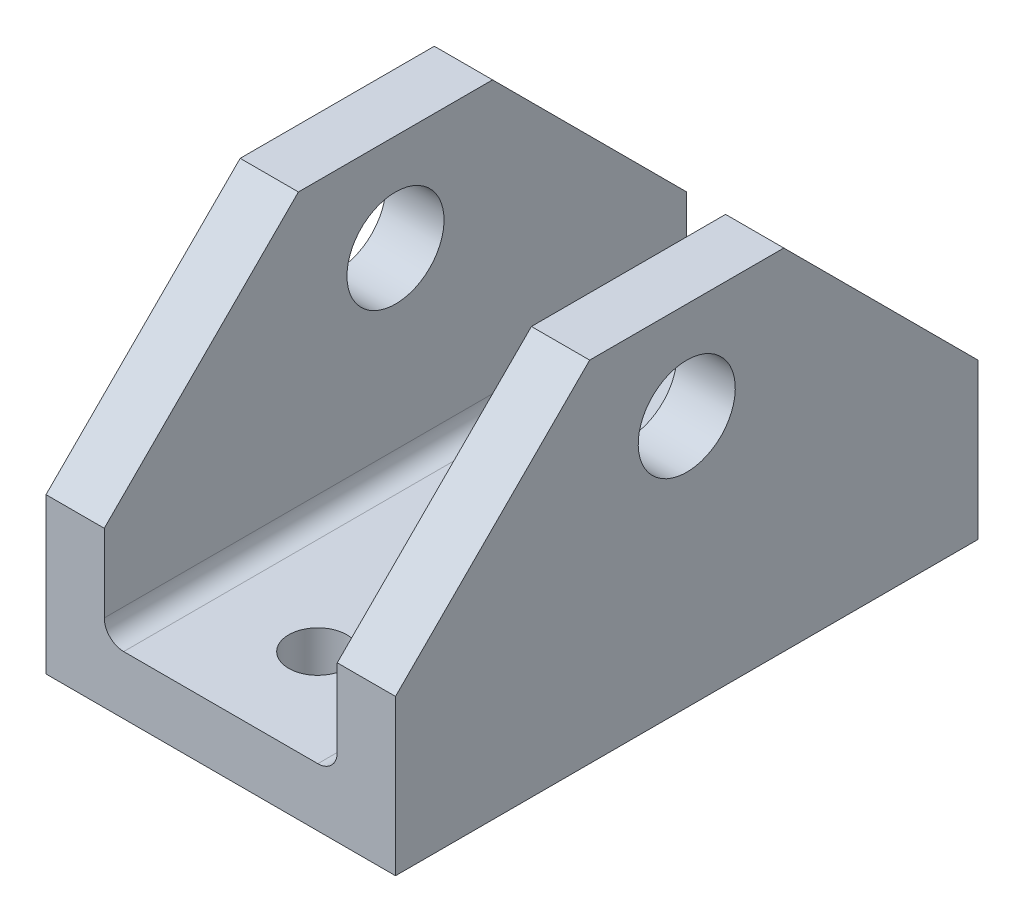
ISO-10303-21;
HEADER;
FILE_DESCRIPTION(('STEP AP214'),'2;1');
FILE_NAME('part.step','',(''),(''),'','','');
FILE_SCHEMA(('AUTOMOTIVE_DESIGN { 1 0 10303 214 1 1 1 1 }'));
ENDSEC;
DATA;
#1=APPLICATION_CONTEXT('core data for automotive mechanical design processes');
#2=APPLICATION_PROTOCOL_DEFINITION('international standard','automotive_design',2000,#1);
#3=PRODUCT_CONTEXT('',#1,'mechanical');
#4=PRODUCT('Part','Part','',(#3));
#5=PRODUCT_RELATED_PRODUCT_CATEGORY('part','',(#4));
#6=PRODUCT_DEFINITION_FORMATION('','',#4);
#7=PRODUCT_DEFINITION_CONTEXT('part definition',#1,'design');
#8=PRODUCT_DEFINITION('design','',#6,#7);
#9=PRODUCT_DEFINITION_SHAPE('','',#8);
#10=(LENGTH_UNIT() NAMED_UNIT(*) SI_UNIT(.MILLI.,.METRE.));
#11=(NAMED_UNIT(*) PLANE_ANGLE_UNIT() SI_UNIT($,.RADIAN.));
#12=(NAMED_UNIT(*) SI_UNIT($,.STERADIAN.) SOLID_ANGLE_UNIT());
#13=UNCERTAINTY_MEASURE_WITH_UNIT(LENGTH_MEASURE(1.E-05),#10,'distance_accuracy_value','');
#14=(GEOMETRIC_REPRESENTATION_CONTEXT(3) GLOBAL_UNCERTAINTY_ASSIGNED_CONTEXT((#13)) GLOBAL_UNIT_ASSIGNED_CONTEXT((#10,
#11,#12)) REPRESENTATION_CONTEXT('',''));
#15=CARTESIAN_POINT('',(0.,0.,0.));
#16=DIRECTION('',(0.,0.,1.));
#17=DIRECTION('',(1.,0.,0.));
#18=AXIS2_PLACEMENT_3D('',#15,#16,#17);
#19=CARTESIAN_POINT('',(6.,0.,15.));
#20=DIRECTION('',(1.,0.,0.));
#21=DIRECTION('',(0.,0.,-1.));
#22=AXIS2_PLACEMENT_3D('',#19,#20,#21);
#23=PLANE('',#22);
#24=CARTESIAN_POINT('',(6.,10.,0.));
#25=DIRECTION('',(1.,0.,0.));
#26=DIRECTION('',(0.,0.,-1.));
#27=AXIS2_PLACEMENT_3D('',#24,#25,#26);
#28=CIRCLE('',#27,2.5);
#29=CARTESIAN_POINT('',(6.,10.,-2.5));
#30=VERTEX_POINT('',#29);
#31=EDGE_CURVE('E278',#30,#30,#28,.T.);
#32=ORIENTED_EDGE('',*,*,#31,.T.);
#33=EDGE_LOOP('',(#32));
#34=FACE_BOUND('',#33,.T.);
#35=DIRECTION('',(0.,-1.,0.));
#36=VECTOR('',#35,1.);
#37=CARTESIAN_POINT('',(6.,0.,-15.));
#38=LINE('',#37,#36);
#39=CARTESIAN_POINT('',(6.,5.,-15.));
#40=VERTEX_POINT('',#39);
#41=CARTESIAN_POINT('',(6.,1.,-15.));
#42=VERTEX_POINT('',#41);
#43=EDGE_CURVE('E185',#40,#42,#38,.T.);
#44=ORIENTED_EDGE('',*,*,#43,.T.);
#45=DIRECTION('',(0.,0.,-1.));
#46=VECTOR('',#45,1.);
#47=CARTESIAN_POINT('',(6.,1.,15.));
#48=LINE('',#47,#46);
#49=CARTESIAN_POINT('',(6.,1.,15.));
#50=VERTEX_POINT('',#49);
#51=EDGE_CURVE('E232',#42,#50,#48,.F.);
#52=ORIENTED_EDGE('',*,*,#51,.T.);
#53=DIRECTION('',(0.,-1.,0.));
#54=VECTOR('',#53,1.);
#55=CARTESIAN_POINT('',(6.,0.,15.));
#56=LINE('',#55,#54);
#57=CARTESIAN_POINT('',(6.,5.,15.));
#58=VERTEX_POINT('',#57);
#59=EDGE_CURVE('E205',#58,#50,#56,.T.);
#60=ORIENTED_EDGE('',*,*,#59,.F.);
#61=DIRECTION('',(0.,0.707106781186548,-0.707106781186547));
#62=VECTOR('',#61,1.);
#63=CARTESIAN_POINT('',(6.,2.5,17.5));
#64=LINE('',#63,#62);
#65=CARTESIAN_POINT('',(6.,15.,5.));
#66=VERTEX_POINT('',#65);
#67=EDGE_CURVE('E148',#58,#66,#64,.T.);
#68=ORIENTED_EDGE('',*,*,#67,.T.);
#69=DIRECTION('',(0.,0.,-1.));
#70=VECTOR('',#69,1.);
#71=CARTESIAN_POINT('',(6.,15.,15.));
#72=LINE('',#71,#70);
#73=CARTESIAN_POINT('',(6.,15.,-5.));
#74=VERTEX_POINT('',#73);
#75=EDGE_CURVE('E175',#66,#74,#72,.T.);
#76=ORIENTED_EDGE('',*,*,#75,.T.);
#77=DIRECTION('',(0.,-0.707106781186548,-0.707106781186547));
#78=VECTOR('',#77,1.);
#79=CARTESIAN_POINT('',(6.,17.5,-2.50000000000001));
#80=LINE('',#79,#78);
#81=EDGE_CURVE('E300',#74,#40,#80,.T.);
#82=ORIENTED_EDGE('',*,*,#81,.T.);
#83=EDGE_LOOP('',(#44,#52,#60,#68,#76,#82));
#84=FACE_BOUND('',#83,.T.);
#85=ADVANCED_FACE('F42',(#34,#84),#23,.F.);
#86=CARTESIAN_POINT('',(-6.,0.,15.));
#87=DIRECTION('',(0.,-1.,0.));
#88=DIRECTION('',(0.,0.,-1.));
#89=AXIS2_PLACEMENT_3D('',#86,#87,#88);
#90=PLANE('',#89);
#91=CARTESIAN_POINT('',(0.,0.,-10.));
#92=DIRECTION('',(0.,1.,0.));
#93=DIRECTION('',(0.,0.,1.));
#94=AXIS2_PLACEMENT_3D('',#91,#92,#93);
#95=CIRCLE('',#94,1.5);
#96=CARTESIAN_POINT('',(0.,0.,-8.5));
#97=VERTEX_POINT('',#96);
#98=EDGE_CURVE('E282',#97,#97,#95,.T.);
#99=ORIENTED_EDGE('',*,*,#98,.F.);
#100=EDGE_LOOP('',(#99));
#101=FACE_BOUND('',#100,.T.);
#102=CARTESIAN_POINT('',(0.,0.,10.));
#103=DIRECTION('',(0.,1.,0.));
#104=DIRECTION('',(0.,0.,-1.));
#105=AXIS2_PLACEMENT_3D('',#102,#103,#104);
#106=CIRCLE('',#105,1.5);
#107=CARTESIAN_POINT('',(0.,0.,8.5));
#108=VERTEX_POINT('',#107);
#109=EDGE_CURVE('E273',#108,#108,#106,.T.);
#110=ORIENTED_EDGE('',*,*,#109,.F.);
#111=EDGE_LOOP('',(#110));
#112=FACE_BOUND('',#111,.T.);
#113=DIRECTION('',(-1.,0.,0.));
#114=VECTOR('',#113,1.);
#115=CARTESIAN_POINT('',(-6.,0.,15.));
#116=LINE('',#115,#114);
#117=CARTESIAN_POINT('',(5.,0.,15.));
#118=VERTEX_POINT('',#117);
#119=CARTESIAN_POINT('',(-5.,0.,15.));
#120=VERTEX_POINT('',#119);
#121=EDGE_CURVE('E265',#118,#120,#116,.T.);
#122=ORIENTED_EDGE('',*,*,#121,.F.);
#123=DIRECTION('',(0.,0.,-1.));
#124=VECTOR('',#123,1.);
#125=CARTESIAN_POINT('',(5.,0.,-15.));
#126=LINE('',#125,#124);
#127=CARTESIAN_POINT('',(5.,0.,-15.));
#128=VERTEX_POINT('',#127);
#129=EDGE_CURVE('E228',#118,#128,#126,.T.);
#130=ORIENTED_EDGE('',*,*,#129,.T.);
#131=DIRECTION('',(-1.,0.,0.));
#132=VECTOR('',#131,1.);
#133=CARTESIAN_POINT('',(-6.,0.,-15.));
#134=LINE('',#133,#132);
#135=CARTESIAN_POINT('',(-5.,0.,-15.));
#136=VERTEX_POINT('',#135);
#137=EDGE_CURVE('E189',#128,#136,#134,.T.);
#138=ORIENTED_EDGE('',*,*,#137,.T.);
#139=DIRECTION('',(0.,0.,-1.));
#140=VECTOR('',#139,1.);
#141=CARTESIAN_POINT('',(-5.,0.,15.));
#142=LINE('',#141,#140);
#143=EDGE_CURVE('E153',#136,#120,#142,.F.);
#144=ORIENTED_EDGE('',*,*,#143,.T.);
#145=EDGE_LOOP('',(#122,#130,#138,#144));
#146=FACE_BOUND('',#145,.T.);
#147=ADVANCED_FACE('F252',(#101,#112,#146),#90,.F.);
#148=CARTESIAN_POINT('',(-6.,0.,15.));
#149=DIRECTION('',(-1.,0.,0.));
#150=DIRECTION('',(0.,0.,1.));
#151=AXIS2_PLACEMENT_3D('',#148,#149,#150);
#152=PLANE('',#151);
#153=CARTESIAN_POINT('',(-6.,10.,0.));
#154=DIRECTION('',(-1.,0.,0.));
#155=DIRECTION('',(0.,0.,1.));
#156=AXIS2_PLACEMENT_3D('',#153,#154,#155);
#157=CIRCLE('',#156,2.5);
#158=CARTESIAN_POINT('',(-6.,10.,2.5));
#159=VERTEX_POINT('',#158);
#160=EDGE_CURVE('E292',#159,#159,#157,.T.);
#161=ORIENTED_EDGE('',*,*,#160,.T.);
#162=EDGE_LOOP('',(#161));
#163=FACE_BOUND('',#162,.T.);
#164=DIRECTION('',(0.,1.,0.));
#165=VECTOR('',#164,1.);
#166=CARTESIAN_POINT('',(-6.,0.,15.));
#167=LINE('',#166,#165);
#168=CARTESIAN_POINT('',(-6.,1.,15.));
#169=VERTEX_POINT('',#168);
#170=CARTESIAN_POINT('',(-6.,5.,15.));
#171=VERTEX_POINT('',#170);
#172=EDGE_CURVE('E259',#169,#171,#167,.T.);
#173=ORIENTED_EDGE('',*,*,#172,.F.);
#174=DIRECTION('',(0.,0.,-1.));
#175=VECTOR('',#174,1.);
#176=CARTESIAN_POINT('',(-6.,1.,-15.));
#177=LINE('',#176,#175);
#178=CARTESIAN_POINT('',(-6.,1.,-15.));
#179=VERTEX_POINT('',#178);
#180=EDGE_CURVE('E235',#169,#179,#177,.T.);
#181=ORIENTED_EDGE('',*,*,#180,.T.);
#182=DIRECTION('',(0.,1.,0.));
#183=VECTOR('',#182,1.);
#184=CARTESIAN_POINT('',(-6.,0.,-15.));
#185=LINE('',#184,#183);
#186=CARTESIAN_POINT('',(-6.,5.,-15.));
#187=VERTEX_POINT('',#186);
#188=EDGE_CURVE('E194',#179,#187,#185,.T.);
#189=ORIENTED_EDGE('',*,*,#188,.T.);
#190=DIRECTION('',(0.,0.707106781186548,0.707106781186547));
#191=VECTOR('',#190,1.);
#192=CARTESIAN_POINT('',(-6.,17.5,-2.50000000000001));
#193=LINE('',#192,#191);
#194=CARTESIAN_POINT('',(-6.,15.,-5.));
#195=VERTEX_POINT('',#194);
#196=EDGE_CURVE('E304',#187,#195,#193,.T.);
#197=ORIENTED_EDGE('',*,*,#196,.T.);
#198=DIRECTION('',(0.,0.,-1.));
#199=VECTOR('',#198,1.);
#200=CARTESIAN_POINT('',(-6.,15.,15.));
#201=LINE('',#200,#199);
#202=CARTESIAN_POINT('',(-6.,15.,5.));
#203=VERTEX_POINT('',#202);
#204=EDGE_CURVE('E220',#203,#195,#201,.T.);
#205=ORIENTED_EDGE('',*,*,#204,.F.);
#206=DIRECTION('',(0.,-0.707106781186548,0.707106781186547));
#207=VECTOR('',#206,1.);
#208=CARTESIAN_POINT('',(-6.,2.5,17.5));
#209=LINE('',#208,#207);
#210=EDGE_CURVE('E261',#203,#171,#209,.T.);
#211=ORIENTED_EDGE('',*,*,#210,.T.);
#212=EDGE_LOOP('',(#173,#181,#189,#197,#205,#211));
#213=FACE_BOUND('',#212,.T.);
#214=ADVANCED_FACE('F255',(#163,#213),#152,.F.);
#215=CARTESIAN_POINT('',(-6.,15.,15.));
#216=DIRECTION('',(0.,-1.,0.));
#217=DIRECTION('',(0.,0.,-1.));
#218=AXIS2_PLACEMENT_3D('',#215,#216,#217);
#219=PLANE('',#218);
#220=ORIENTED_EDGE('',*,*,#204,.T.);
#221=DIRECTION('',(1.,0.,0.));
#222=VECTOR('',#221,1.);
#223=CARTESIAN_POINT('',(-23.142135623731,15.,-5.));
#224=LINE('',#223,#222);
#225=CARTESIAN_POINT('',(-9.,15.,-5.));
#226=VERTEX_POINT('',#225);
#227=EDGE_CURVE('E316',#226,#195,#224,.T.);
#228=ORIENTED_EDGE('',*,*,#227,.F.);
#229=DIRECTION('',(0.,0.,-1.));
#230=VECTOR('',#229,1.);
#231=CARTESIAN_POINT('',(-9.,15.,15.));
#232=LINE('',#231,#230);
#233=CARTESIAN_POINT('',(-9.,15.,5.));
#234=VERTEX_POINT('',#233);
#235=EDGE_CURVE('E216',#234,#226,#232,.T.);
#236=ORIENTED_EDGE('',*,*,#235,.F.);
#237=DIRECTION('',(1.,0.,0.));
#238=VECTOR('',#237,1.);
#239=CARTESIAN_POINT('',(-23.142135623731,15.,5.));
#240=LINE('',#239,#238);
#241=EDGE_CURVE('E330',#234,#203,#240,.T.);
#242=ORIENTED_EDGE('',*,*,#241,.T.);
#243=EDGE_LOOP('',(#220,#228,#236,#242));
#244=FACE_BOUND('',#243,.T.);
#245=ADVANCED_FACE('F366',(#244),#219,.F.);
#246=CARTESIAN_POINT('',(-9.,15.,15.));
#247=DIRECTION('',(1.,0.,0.));
#248=DIRECTION('',(0.,1.,0.));
#249=AXIS2_PLACEMENT_3D('',#246,#247,#248);
#250=PLANE('',#249);
#251=CARTESIAN_POINT('',(-9.,10.,0.));
#252=DIRECTION('',(1.,0.,0.));
#253=DIRECTION('',(0.,1.,0.));
#254=AXIS2_PLACEMENT_3D('',#251,#252,#253);
#255=CIRCLE('',#254,2.5);
#256=CARTESIAN_POINT('',(-9.,12.5,0.));
#257=VERTEX_POINT('',#256);
#258=EDGE_CURVE('E307',#257,#257,#255,.F.);
#259=ORIENTED_EDGE('',*,*,#258,.F.);
#260=EDGE_LOOP('',(#259));
#261=FACE_BOUND('',#260,.T.);
#262=ORIENTED_EDGE('',*,*,#235,.T.);
#263=DIRECTION('',(0.,0.707106781186548,0.707106781186547));
#264=VECTOR('',#263,1.);
#265=CARTESIAN_POINT('',(-9.,4.99999999999999,-15.));
#266=LINE('',#265,#264);
#267=CARTESIAN_POINT('',(-9.,5.,-15.));
#268=VERTEX_POINT('',#267);
#269=EDGE_CURVE('E168',#268,#226,#266,.T.);
#270=ORIENTED_EDGE('',*,*,#269,.F.);
#271=DIRECTION('',(0.,-1.,0.));
#272=VECTOR('',#271,1.);
#273=CARTESIAN_POINT('',(-9.,15.,-15.));
#274=LINE('',#273,#272);
#275=CARTESIAN_POINT('',(-9.,-3.,-15.));
#276=VERTEX_POINT('',#275);
#277=EDGE_CURVE('E197',#268,#276,#274,.T.);
#278=ORIENTED_EDGE('',*,*,#277,.T.);
#279=DIRECTION('',(0.,0.,-1.));
#280=VECTOR('',#279,1.);
#281=CARTESIAN_POINT('',(-9.,-3.,15.));
#282=LINE('',#281,#280);
#283=CARTESIAN_POINT('',(-9.,-3.,15.));
#284=VERTEX_POINT('',#283);
#285=EDGE_CURVE('E212',#284,#276,#282,.T.);
#286=ORIENTED_EDGE('',*,*,#285,.F.);
#287=DIRECTION('',(0.,-1.,0.));
#288=VECTOR('',#287,1.);
#289=CARTESIAN_POINT('',(-9.,15.,15.));
#290=LINE('',#289,#288);
#291=CARTESIAN_POINT('',(-9.,5.,15.));
#292=VERTEX_POINT('',#291);
#293=EDGE_CURVE('E181',#292,#284,#290,.T.);
#294=ORIENTED_EDGE('',*,*,#293,.F.);
#295=DIRECTION('',(0.,-0.707106781186548,0.707106781186547));
#296=VECTOR('',#295,1.);
#297=CARTESIAN_POINT('',(-9.,4.99999999999999,15.));
#298=LINE('',#297,#296);
#299=EDGE_CURVE('E315',#234,#292,#298,.T.);
#300=ORIENTED_EDGE('',*,*,#299,.F.);
#301=EDGE_LOOP('',(#262,#270,#278,#286,#294,#300));
#302=FACE_BOUND('',#301,.T.);
#303=ADVANCED_FACE('F360',(#261,#302),#250,.F.);
#304=CARTESIAN_POINT('',(9.,-3.,15.));
#305=DIRECTION('',(0.,1.,0.));
#306=DIRECTION('',(0.,0.,1.));
#307=AXIS2_PLACEMENT_3D('',#304,#305,#306);
#308=PLANE('',#307);
#309=CARTESIAN_POINT('',(0.,-3.,-10.));
#310=DIRECTION('',(0.,1.,0.));
#311=DIRECTION('',(0.,0.,1.));
#312=AXIS2_PLACEMENT_3D('',#309,#310,#311);
#313=CIRCLE('',#312,1.5);
#314=CARTESIAN_POINT('',(0.,-3.,-8.5));
#315=VERTEX_POINT('',#314);
#316=EDGE_CURVE('E190',#315,#315,#313,.T.);
#317=ORIENTED_EDGE('',*,*,#316,.T.);
#318=EDGE_LOOP('',(#317));
#319=FACE_BOUND('',#318,.T.);
#320=CARTESIAN_POINT('',(0.,-3.,10.));
#321=DIRECTION('',(0.,1.,0.));
#322=DIRECTION('',(0.,0.,-1.));
#323=AXIS2_PLACEMENT_3D('',#320,#321,#322);
#324=CIRCLE('',#323,1.5);
#325=CARTESIAN_POINT('',(0.,-3.,8.5));
#326=VERTEX_POINT('',#325);
#327=EDGE_CURVE('E277',#326,#326,#324,.T.);
#328=ORIENTED_EDGE('',*,*,#327,.T.);
#329=EDGE_LOOP('',(#328));
#330=FACE_BOUND('',#329,.T.);
#331=DIRECTION('',(1.,0.,0.));
#332=VECTOR('',#331,1.);
#333=CARTESIAN_POINT('',(9.,-3.,-15.));
#334=LINE('',#333,#332);
#335=CARTESIAN_POINT('',(9.,-3.,-15.));
#336=VERTEX_POINT('',#335);
#337=EDGE_CURVE('E200',#276,#336,#334,.T.);
#338=ORIENTED_EDGE('',*,*,#337,.T.);
#339=DIRECTION('',(0.,0.,-1.));
#340=VECTOR('',#339,1.);
#341=CARTESIAN_POINT('',(9.,-3.,15.));
#342=LINE('',#341,#340);
#343=CARTESIAN_POINT('',(9.,-3.,15.));
#344=VERTEX_POINT('',#343);
#345=EDGE_CURVE('E209',#344,#336,#342,.T.);
#346=ORIENTED_EDGE('',*,*,#345,.F.);
#347=DIRECTION('',(1.,0.,0.));
#348=VECTOR('',#347,1.);
#349=CARTESIAN_POINT('',(9.,-3.,15.));
#350=LINE('',#349,#348);
#351=EDGE_CURVE('E172',#284,#344,#350,.T.);
#352=ORIENTED_EDGE('',*,*,#351,.F.);
#353=ORIENTED_EDGE('',*,*,#285,.T.);
#354=EDGE_LOOP('',(#338,#346,#352,#353));
#355=FACE_BOUND('',#354,.T.);
#356=ADVANCED_FACE('F355',(#319,#330,#355),#308,.F.);
#357=CARTESIAN_POINT('',(9.,15.,15.));
#358=DIRECTION('',(-1.,0.,0.));
#359=DIRECTION('',(0.,-1.,0.));
#360=AXIS2_PLACEMENT_3D('',#357,#358,#359);
#361=PLANE('',#360);
#362=CARTESIAN_POINT('',(9.,10.,0.));
#363=DIRECTION('',(1.,0.,0.));
#364=DIRECTION('',(0.,1.,0.));
#365=AXIS2_PLACEMENT_3D('',#362,#363,#364);
#366=CIRCLE('',#365,2.5);
#367=CARTESIAN_POINT('',(9.,12.5,0.));
#368=VERTEX_POINT('',#367);
#369=EDGE_CURVE('E311',#368,#368,#366,.T.);
#370=ORIENTED_EDGE('',*,*,#369,.F.);
#371=EDGE_LOOP('',(#370));
#372=FACE_BOUND('',#371,.T.);
#373=DIRECTION('',(0.,1.,0.));
#374=VECTOR('',#373,1.);
#375=CARTESIAN_POINT('',(9.,15.,-15.));
#376=LINE('',#375,#374);
#377=CARTESIAN_POINT('',(9.,5.,-15.));
#378=VERTEX_POINT('',#377);
#379=EDGE_CURVE('E203',#336,#378,#376,.T.);
#380=ORIENTED_EDGE('',*,*,#379,.T.);
#381=DIRECTION('',(0.,-0.707106781186548,-0.707106781186547));
#382=VECTOR('',#381,1.);
#383=CARTESIAN_POINT('',(9.,5.,-15.));
#384=LINE('',#383,#382);
#385=CARTESIAN_POINT('',(9.,15.,-5.));
#386=VERTEX_POINT('',#385);
#387=EDGE_CURVE('E323',#386,#378,#384,.T.);
#388=ORIENTED_EDGE('',*,*,#387,.F.);
#389=DIRECTION('',(0.,0.,-1.));
#390=VECTOR('',#389,1.);
#391=CARTESIAN_POINT('',(9.,15.,15.));
#392=LINE('',#391,#390);
#393=CARTESIAN_POINT('',(9.,15.,5.));
#394=VERTEX_POINT('',#393);
#395=EDGE_CURVE('E165',#394,#386,#392,.T.);
#396=ORIENTED_EDGE('',*,*,#395,.F.);
#397=DIRECTION('',(0.,0.707106781186548,-0.707106781186547));
#398=VECTOR('',#397,1.);
#399=CARTESIAN_POINT('',(9.,5.,15.));
#400=LINE('',#399,#398);
#401=CARTESIAN_POINT('',(9.,5.,15.));
#402=VERTEX_POINT('',#401);
#403=EDGE_CURVE('E145',#402,#394,#400,.T.);
#404=ORIENTED_EDGE('',*,*,#403,.F.);
#405=DIRECTION('',(0.,1.,0.));
#406=VECTOR('',#405,1.);
#407=CARTESIAN_POINT('',(9.,15.,15.));
#408=LINE('',#407,#406);
#409=EDGE_CURVE('E162',#344,#402,#408,.T.);
#410=ORIENTED_EDGE('',*,*,#409,.F.);
#411=ORIENTED_EDGE('',*,*,#345,.T.);
#412=EDGE_LOOP('',(#380,#388,#396,#404,#410,#411));
#413=FACE_BOUND('',#412,.T.);
#414=ADVANCED_FACE('F160',(#372,#413),#361,.F.);
#415=CARTESIAN_POINT('',(6.,15.,15.));
#416=DIRECTION('',(0.,-1.,0.));
#417=DIRECTION('',(0.,0.,-1.));
#418=AXIS2_PLACEMENT_3D('',#415,#416,#417);
#419=PLANE('',#418);
#420=ORIENTED_EDGE('',*,*,#395,.T.);
#421=EDGE_CURVE('E320',#74,#386,#224,.T.);
#422=ORIENTED_EDGE('',*,*,#421,.F.);
#423=ORIENTED_EDGE('',*,*,#75,.F.);
#424=EDGE_CURVE('E333',#66,#394,#240,.T.);
#425=ORIENTED_EDGE('',*,*,#424,.T.);
#426=EDGE_LOOP('',(#420,#422,#423,#425));
#427=FACE_BOUND('',#426,.T.);
#428=ADVANCED_FACE('F341',(#427),#419,.F.);
#429=CARTESIAN_POINT('',(0.,0.,15.));
#430=DIRECTION('',(0.,0.,-1.));
#431=DIRECTION('',(-1.,0.,0.));
#432=AXIS2_PLACEMENT_3D('',#429,#430,#431);
#433=PLANE('',#432);
#434=ORIENTED_EDGE('',*,*,#409,.T.);
#435=DIRECTION('',(-1.,0.,0.));
#436=VECTOR('',#435,1.);
#437=CARTESIAN_POINT('',(0.,5.,15.));
#438=LINE('',#437,#436);
#439=EDGE_CURVE('E142',#402,#58,#438,.T.);
#440=ORIENTED_EDGE('',*,*,#439,.T.);
#441=ORIENTED_EDGE('',*,*,#59,.T.);
#442=CARTESIAN_POINT('',(5.,1.,15.));
#443=DIRECTION('',(0.,0.,-1.));
#444=DIRECTION('',(-1.,0.,0.));
#445=AXIS2_PLACEMENT_3D('',#442,#443,#444);
#446=CIRCLE('',#445,1.);
#447=EDGE_CURVE('E241',#50,#118,#446,.T.);
#448=ORIENTED_EDGE('',*,*,#447,.T.);
#449=ORIENTED_EDGE('',*,*,#121,.T.);
#450=CARTESIAN_POINT('',(-5.,1.,15.));
#451=DIRECTION('',(0.,0.,-1.));
#452=DIRECTION('',(-1.,0.,0.));
#453=AXIS2_PLACEMENT_3D('',#450,#451,#452);
#454=CIRCLE('',#453,1.);
#455=EDGE_CURVE('E11',#120,#169,#454,.T.);
#456=ORIENTED_EDGE('',*,*,#455,.T.);
#457=ORIENTED_EDGE('',*,*,#172,.T.);
#458=DIRECTION('',(1.,0.,0.));
#459=VECTOR('',#458,1.);
#460=CARTESIAN_POINT('',(-23.142135623731,4.99999999999999,15.));
#461=LINE('',#460,#459);
#462=EDGE_CURVE('E167',#292,#171,#461,.T.);
#463=ORIENTED_EDGE('',*,*,#462,.F.);
#464=ORIENTED_EDGE('',*,*,#293,.T.);
#465=ORIENTED_EDGE('',*,*,#351,.T.);
#466=EDGE_LOOP('',(#434,#440,#441,#448,#449,#456,#457,#463,#464,#465));
#467=FACE_BOUND('',#466,.T.);
#468=ADVANCED_FACE('F170',(#467),#433,.F.);
#469=CARTESIAN_POINT('',(0.,0.,-15.));
#470=DIRECTION('',(0.,0.,-1.));
#471=DIRECTION('',(-1.,0.,0.));
#472=AXIS2_PLACEMENT_3D('',#469,#470,#471);
#473=PLANE('',#472);
#474=DIRECTION('',(-1.,0.,0.));
#475=VECTOR('',#474,1.);
#476=CARTESIAN_POINT('',(0.,5.,-15.));
#477=LINE('',#476,#475);
#478=EDGE_CURVE('E154',#378,#40,#477,.T.);
#479=ORIENTED_EDGE('',*,*,#478,.F.);
#480=ORIENTED_EDGE('',*,*,#379,.F.);
#481=ORIENTED_EDGE('',*,*,#337,.F.);
#482=ORIENTED_EDGE('',*,*,#277,.F.);
#483=DIRECTION('',(1.,0.,0.));
#484=VECTOR('',#483,1.);
#485=CARTESIAN_POINT('',(-23.142135623731,4.99999999999999,-15.));
#486=LINE('',#485,#484);
#487=EDGE_CURVE('E319',#268,#187,#486,.T.);
#488=ORIENTED_EDGE('',*,*,#487,.T.);
#489=ORIENTED_EDGE('',*,*,#188,.F.);
#490=CARTESIAN_POINT('',(-5.,1.,-15.));
#491=DIRECTION('',(0.,0.,-1.));
#492=DIRECTION('',(-1.,0.,0.));
#493=AXIS2_PLACEMENT_3D('',#490,#491,#492);
#494=CIRCLE('',#493,1.);
#495=EDGE_CURVE('E51',#179,#136,#494,.F.);
#496=ORIENTED_EDGE('',*,*,#495,.T.);
#497=ORIENTED_EDGE('',*,*,#137,.F.);
#498=CARTESIAN_POINT('',(5.,1.,-15.));
#499=DIRECTION('',(0.,0.,-1.));
#500=DIRECTION('',(-1.,0.,0.));
#501=AXIS2_PLACEMENT_3D('',#498,#499,#500);
#502=CIRCLE('',#501,1.);
#503=EDGE_CURVE('E238',#128,#42,#502,.F.);
#504=ORIENTED_EDGE('',*,*,#503,.T.);
#505=ORIENTED_EDGE('',*,*,#43,.F.);
#506=EDGE_LOOP('',(#479,#480,#481,#482,#488,#489,#496,#497,#504,#505));
#507=FACE_BOUND('',#506,.T.);
#508=ADVANCED_FACE('F248',(#507),#473,.T.);
#509=CARTESIAN_POINT('',(0.,-3.,10.));
#510=DIRECTION('',(0.,1.,0.));
#511=DIRECTION('',(0.,0.,1.));
#512=AXIS2_PLACEMENT_3D('',#509,#510,#511);
#513=CYLINDRICAL_SURFACE('',#512,1.5);
#514=ORIENTED_EDGE('',*,*,#327,.F.);
#515=EDGE_LOOP('',(#514));
#516=FACE_BOUND('',#515,.T.);
#517=ORIENTED_EDGE('',*,*,#109,.T.);
#518=EDGE_LOOP('',(#517));
#519=FACE_BOUND('',#518,.T.);
#520=ADVANCED_FACE('F405',(#516,#519),#513,.F.);
#521=CARTESIAN_POINT('',(0.,-3.,-10.));
#522=DIRECTION('',(0.,1.,0.));
#523=DIRECTION('',(0.,0.,1.));
#524=AXIS2_PLACEMENT_3D('',#521,#522,#523);
#525=CYLINDRICAL_SURFACE('',#524,1.5);
#526=ORIENTED_EDGE('',*,*,#316,.F.);
#527=EDGE_LOOP('',(#526));
#528=FACE_BOUND('',#527,.T.);
#529=ORIENTED_EDGE('',*,*,#98,.T.);
#530=EDGE_LOOP('',(#529));
#531=FACE_BOUND('',#530,.T.);
#532=ADVANCED_FACE('F402',(#528,#531),#525,.F.);
#533=CARTESIAN_POINT('',(-23.142135623731,4.99999999999999,-15.));
#534=DIRECTION('',(0.,-0.707106781186547,0.707106781186548));
#535=DIRECTION('',(0.,-0.707106781186548,-0.707106781186547));
#536=AXIS2_PLACEMENT_3D('',#533,#534,#535);
#537=PLANE('',#536);
#538=ORIENTED_EDGE('',*,*,#487,.F.);
#539=ORIENTED_EDGE('',*,*,#269,.T.);
#540=ORIENTED_EDGE('',*,*,#227,.T.);
#541=ORIENTED_EDGE('',*,*,#196,.F.);
#542=EDGE_LOOP('',(#538,#539,#540,#541));
#543=FACE_BOUND('',#542,.T.);
#544=ADVANCED_FACE('F365',(#543),#537,.F.);
#545=ORIENTED_EDGE('',*,*,#421,.T.);
#546=ORIENTED_EDGE('',*,*,#387,.T.);
#547=ORIENTED_EDGE('',*,*,#478,.T.);
#548=ORIENTED_EDGE('',*,*,#81,.F.);
#549=EDGE_LOOP('',(#545,#546,#547,#548));
#550=FACE_BOUND('',#549,.T.);
#551=ADVANCED_FACE('F350',(#550),#537,.F.);
#552=CARTESIAN_POINT('',(-23.142135623731,4.99999999999999,15.));
#553=DIRECTION('',(0.,-0.707106781186547,-0.707106781186548));
#554=DIRECTION('',(0.,0.707106781186548,-0.707106781186547));
#555=AXIS2_PLACEMENT_3D('',#552,#553,#554);
#556=PLANE('',#555);
#557=ORIENTED_EDGE('',*,*,#241,.F.);
#558=ORIENTED_EDGE('',*,*,#299,.T.);
#559=ORIENTED_EDGE('',*,*,#462,.T.);
#560=ORIENTED_EDGE('',*,*,#210,.F.);
#561=EDGE_LOOP('',(#557,#558,#559,#560));
#562=FACE_BOUND('',#561,.T.);
#563=ADVANCED_FACE('F469',(#562),#556,.F.);
#564=ORIENTED_EDGE('',*,*,#439,.F.);
#565=ORIENTED_EDGE('',*,*,#403,.T.);
#566=ORIENTED_EDGE('',*,*,#424,.F.);
#567=ORIENTED_EDGE('',*,*,#67,.F.);
#568=EDGE_LOOP('',(#564,#565,#566,#567));
#569=FACE_BOUND('',#568,.T.);
#570=ADVANCED_FACE('F144',(#569),#556,.F.);
#571=CARTESIAN_POINT('',(-23.142135623731,9.99999999999999,0.));
#572=DIRECTION('',(1.,0.,0.));
#573=DIRECTION('',(0.,1.,0.));
#574=AXIS2_PLACEMENT_3D('',#571,#572,#573);
#575=CYLINDRICAL_SURFACE('',#574,2.5);
#576=ORIENTED_EDGE('',*,*,#369,.T.);
#577=EDGE_LOOP('',(#576));
#578=FACE_BOUND('',#577,.T.);
#579=ORIENTED_EDGE('',*,*,#31,.F.);
#580=EDGE_LOOP('',(#579));
#581=FACE_BOUND('',#580,.T.);
#582=ADVANCED_FACE('F391',(#578,#581),#575,.F.);
#583=ORIENTED_EDGE('',*,*,#258,.T.);
#584=EDGE_LOOP('',(#583));
#585=FACE_BOUND('',#584,.T.);
#586=ORIENTED_EDGE('',*,*,#160,.F.);
#587=EDGE_LOOP('',(#586));
#588=FACE_BOUND('',#587,.T.);
#589=ADVANCED_FACE('F386',(#585,#588),#575,.F.);
#590=CARTESIAN_POINT('',(5.,1.,15.));
#591=DIRECTION('',(0.,0.,1.));
#592=DIRECTION('',(1.,0.,0.));
#593=AXIS2_PLACEMENT_3D('',#590,#591,#592);
#594=CYLINDRICAL_SURFACE('',#593,1.);
#595=ORIENTED_EDGE('',*,*,#447,.F.);
#596=ORIENTED_EDGE('',*,*,#51,.F.);
#597=ORIENTED_EDGE('',*,*,#503,.F.);
#598=ORIENTED_EDGE('',*,*,#129,.F.);
#599=EDGE_LOOP('',(#595,#596,#597,#598));
#600=FACE_BOUND('',#599,.T.);
#601=ADVANCED_FACE('F347',(#600),#594,.F.);
#602=CARTESIAN_POINT('',(-5.,1.,15.));
#603=DIRECTION('',(0.,0.,1.));
#604=DIRECTION('',(1.,0.,0.));
#605=AXIS2_PLACEMENT_3D('',#602,#603,#604);
#606=CYLINDRICAL_SURFACE('',#605,1.);
#607=ORIENTED_EDGE('',*,*,#455,.F.);
#608=ORIENTED_EDGE('',*,*,#143,.F.);
#609=ORIENTED_EDGE('',*,*,#495,.F.);
#610=ORIENTED_EDGE('',*,*,#180,.F.);
#611=EDGE_LOOP('',(#607,#608,#609,#610));
#612=FACE_BOUND('',#611,.T.);
#613=ADVANCED_FACE('F44',(#612),#606,.F.);
#614=CLOSED_SHELL('',(#85,#147,#214,#245,#303,#356,#414,#428,#468,#508,#520,#532,#544,#551,#563,
#570,#582,#589,#601,#613));
#615=MANIFOLD_SOLID_BREP('B2',#614);
#616=ADVANCED_BREP_SHAPE_REPRESENTATION('',(#18,#615),#14);
#617=SHAPE_DEFINITION_REPRESENTATION(#9,#616);
ENDSEC;
END-ISO-10303-21;
